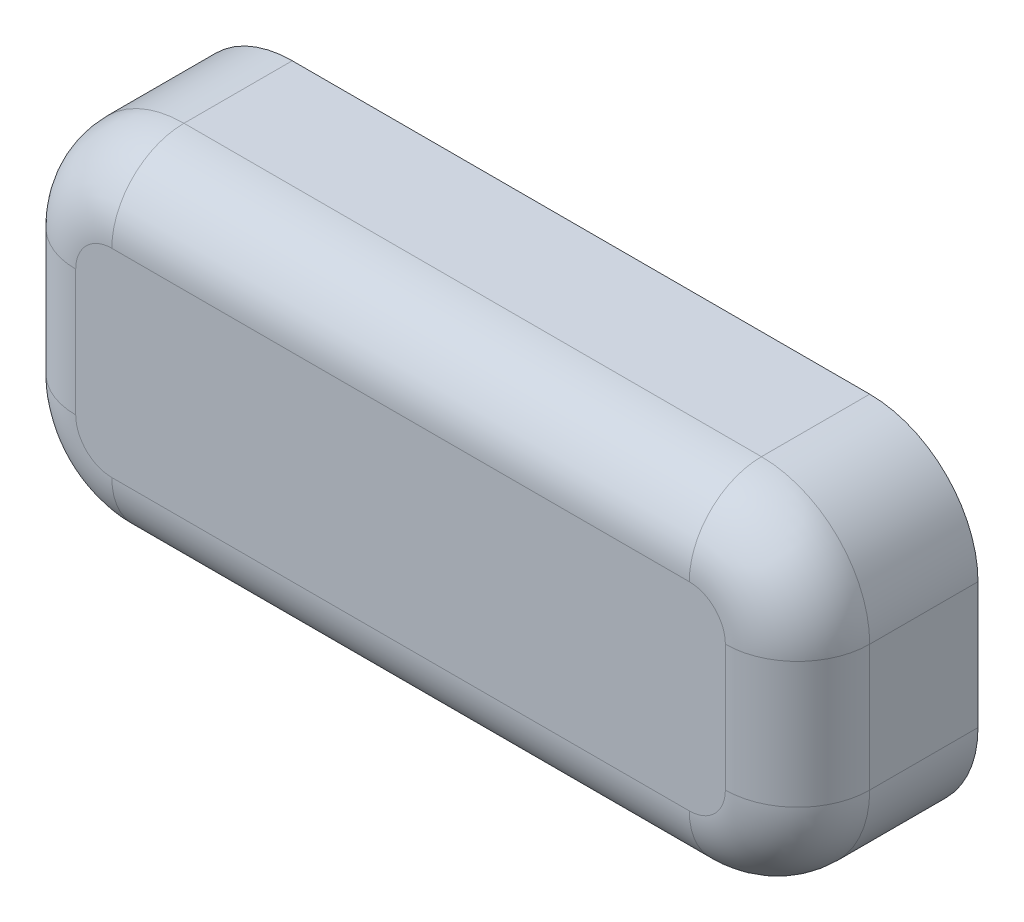
ISO-10303-21;
HEADER;
FILE_DESCRIPTION(('STEP AP214'),'2;1');
FILE_NAME('part.step','',(''),(''),'','','');
FILE_SCHEMA(('AUTOMOTIVE_DESIGN { 1 0 10303 214 1 1 1 1 }'));
ENDSEC;
DATA;
#1=APPLICATION_CONTEXT('core data for automotive mechanical design processes');
#2=APPLICATION_PROTOCOL_DEFINITION('international standard','automotive_design',2000,#1);
#3=PRODUCT_CONTEXT('',#1,'mechanical');
#4=PRODUCT('Part','Part','',(#3));
#5=PRODUCT_RELATED_PRODUCT_CATEGORY('part','',(#4));
#6=PRODUCT_DEFINITION_FORMATION('','',#4);
#7=PRODUCT_DEFINITION_CONTEXT('part definition',#1,'design');
#8=PRODUCT_DEFINITION('design','',#6,#7);
#9=PRODUCT_DEFINITION_SHAPE('','',#8);
#10=(LENGTH_UNIT() NAMED_UNIT(*) SI_UNIT(.MILLI.,.METRE.));
#11=(NAMED_UNIT(*) PLANE_ANGLE_UNIT() SI_UNIT($,.RADIAN.));
#12=(NAMED_UNIT(*) SI_UNIT($,.STERADIAN.) SOLID_ANGLE_UNIT());
#13=UNCERTAINTY_MEASURE_WITH_UNIT(LENGTH_MEASURE(1.E-05),#10,'distance_accuracy_value','');
#14=(GEOMETRIC_REPRESENTATION_CONTEXT(3) GLOBAL_UNCERTAINTY_ASSIGNED_CONTEXT((#13)) GLOBAL_UNIT_ASSIGNED_CONTEXT((#10,
#11,#12)) REPRESENTATION_CONTEXT('',''));
#15=CARTESIAN_POINT('',(0.,0.,0.));
#16=DIRECTION('',(0.,0.,1.));
#17=DIRECTION('',(1.,0.,0.));
#18=AXIS2_PLACEMENT_3D('',#15,#16,#17);
#19=CARTESIAN_POINT('',(0.,0.,0.));
#20=DIRECTION('',(0.,0.,1.));
#21=DIRECTION('',(1.,0.,0.));
#22=AXIS2_PLACEMENT_3D('',#19,#20,#21);
#23=PLANE('',#22);
#24=DIRECTION('',(0.,1.,0.));
#25=VECTOR('',#24,1.);
#26=CARTESIAN_POINT('',(220.,0.,0.));
#27=LINE('',#26,#25);
#28=CARTESIAN_POINT('',(220.,-65.,0.));
#29=VERTEX_POINT('',#28);
#30=CARTESIAN_POINT('',(220.,-30.,0.));
#31=VERTEX_POINT('',#30);
#32=EDGE_CURVE('E285',#29,#31,#27,.T.);
#33=ORIENTED_EDGE('',*,*,#32,.F.);
#34=CARTESIAN_POINT('',(190.,-65.,0.));
#35=DIRECTION('',(0.,0.,1.));
#36=DIRECTION('',(1.,0.,0.));
#37=AXIS2_PLACEMENT_3D('',#34,#35,#36);
#38=CIRCLE('',#37,30.);
#39=CARTESIAN_POINT('',(190.,-95.,0.));
#40=VERTEX_POINT('',#39);
#41=EDGE_CURVE('E302',#29,#40,#38,.F.);
#42=ORIENTED_EDGE('',*,*,#41,.T.);
#43=DIRECTION('',(1.,0.,0.));
#44=VECTOR('',#43,1.);
#45=CARTESIAN_POINT('',(0.,-95.,0.));
#46=LINE('',#45,#44);
#47=CARTESIAN_POINT('',(30.,-95.,0.));
#48=VERTEX_POINT('',#47);
#49=EDGE_CURVE('E282',#48,#40,#46,.T.);
#50=ORIENTED_EDGE('',*,*,#49,.F.);
#51=CARTESIAN_POINT('',(30.,-65.,0.));
#52=DIRECTION('',(0.,0.,1.));
#53=DIRECTION('',(1.,0.,0.));
#54=AXIS2_PLACEMENT_3D('',#51,#52,#53);
#55=CIRCLE('',#54,30.);
#56=CARTESIAN_POINT('',(0.,-65.,0.));
#57=VERTEX_POINT('',#56);
#58=EDGE_CURVE('E298',#48,#57,#55,.F.);
#59=ORIENTED_EDGE('',*,*,#58,.T.);
#60=DIRECTION('',(0.,-1.,0.));
#61=VECTOR('',#60,1.);
#62=CARTESIAN_POINT('',(0.,0.,0.));
#63=LINE('',#62,#61);
#64=CARTESIAN_POINT('',(0.,-30.,0.));
#65=VERTEX_POINT('',#64);
#66=EDGE_CURVE('E279',#65,#57,#63,.T.);
#67=ORIENTED_EDGE('',*,*,#66,.F.);
#68=CARTESIAN_POINT('',(30.,-30.,0.));
#69=DIRECTION('',(0.,0.,1.));
#70=DIRECTION('',(1.,0.,0.));
#71=AXIS2_PLACEMENT_3D('',#68,#69,#70);
#72=CIRCLE('',#71,30.);
#73=CARTESIAN_POINT('',(30.,0.,0.));
#74=VERTEX_POINT('',#73);
#75=EDGE_CURVE('E296',#65,#74,#72,.F.);
#76=ORIENTED_EDGE('',*,*,#75,.T.);
#77=DIRECTION('',(-1.,0.,0.));
#78=VECTOR('',#77,1.);
#79=CARTESIAN_POINT('',(0.,0.,0.));
#80=LINE('',#79,#78);
#81=CARTESIAN_POINT('',(190.,0.,0.));
#82=VERTEX_POINT('',#81);
#83=EDGE_CURVE('E288',#82,#74,#80,.T.);
#84=ORIENTED_EDGE('',*,*,#83,.F.);
#85=CARTESIAN_POINT('',(190.,-30.,0.));
#86=DIRECTION('',(0.,0.,1.));
#87=DIRECTION('',(1.,0.,0.));
#88=AXIS2_PLACEMENT_3D('',#85,#86,#87);
#89=CIRCLE('',#88,30.);
#90=EDGE_CURVE('E300',#82,#31,#89,.F.);
#91=ORIENTED_EDGE('',*,*,#90,.T.);
#92=EDGE_LOOP('',(#33,#42,#50,#59,#67,#76,#84,#91));
#93=FACE_BOUND('',#92,.T.);
#94=CARTESIAN_POINT('',(190.,-65.,0.));
#95=DIRECTION('',(0.,0.,1.));
#96=DIRECTION('',(1.,0.,0.));
#97=AXIS2_PLACEMENT_3D('',#94,#95,#96);
#98=CIRCLE('',#97,28.5);
#99=CARTESIAN_POINT('',(218.5,-64.9999999999999,0.));
#100=VERTEX_POINT('',#99);
#101=CARTESIAN_POINT('',(190.,-93.5,0.));
#102=VERTEX_POINT('',#101);
#103=EDGE_CURVE('E271',#100,#102,#98,.F.);
#104=ORIENTED_EDGE('',*,*,#103,.F.);
#105=DIRECTION('',(0.,1.,0.));
#106=VECTOR('',#105,1.);
#107=CARTESIAN_POINT('',(218.5,0.,0.));
#108=LINE('',#107,#106);
#109=CARTESIAN_POINT('',(218.5,-30.,0.));
#110=VERTEX_POINT('',#109);
#111=EDGE_CURVE('E268',#100,#110,#108,.T.);
#112=ORIENTED_EDGE('',*,*,#111,.T.);
#113=CARTESIAN_POINT('',(190.,-30.,0.));
#114=DIRECTION('',(0.,0.,1.));
#115=DIRECTION('',(1.,0.,0.));
#116=AXIS2_PLACEMENT_3D('',#113,#114,#115);
#117=CIRCLE('',#116,28.5);
#118=CARTESIAN_POINT('',(190.,-1.5,0.));
#119=VERTEX_POINT('',#118);
#120=EDGE_CURVE('E269',#119,#110,#117,.F.);
#121=ORIENTED_EDGE('',*,*,#120,.F.);
#122=DIRECTION('',(-1.,0.,0.));
#123=VECTOR('',#122,1.);
#124=CARTESIAN_POINT('',(0.,-1.5,0.));
#125=LINE('',#124,#123);
#126=CARTESIAN_POINT('',(30.,-1.5,0.));
#127=VERTEX_POINT('',#126);
#128=EDGE_CURVE('E64',#119,#127,#125,.T.);
#129=ORIENTED_EDGE('',*,*,#128,.T.);
#130=CARTESIAN_POINT('',(30.,-30.,0.));
#131=DIRECTION('',(0.,0.,1.));
#132=DIRECTION('',(1.,0.,0.));
#133=AXIS2_PLACEMENT_3D('',#130,#131,#132);
#134=CIRCLE('',#133,28.5);
#135=CARTESIAN_POINT('',(1.50000000000001,-30.,0.));
#136=VERTEX_POINT('',#135);
#137=EDGE_CURVE('E262',#136,#127,#134,.F.);
#138=ORIENTED_EDGE('',*,*,#137,.F.);
#139=DIRECTION('',(0.,-1.,0.));
#140=VECTOR('',#139,1.);
#141=CARTESIAN_POINT('',(1.5,0.,0.));
#142=LINE('',#141,#140);
#143=CARTESIAN_POINT('',(1.50000000000001,-65.,0.));
#144=VERTEX_POINT('',#143);
#145=EDGE_CURVE('E231',#136,#144,#142,.T.);
#146=ORIENTED_EDGE('',*,*,#145,.T.);
#147=CARTESIAN_POINT('',(30.,-65.,0.));
#148=DIRECTION('',(0.,0.,1.));
#149=DIRECTION('',(1.,0.,0.));
#150=AXIS2_PLACEMENT_3D('',#147,#148,#149);
#151=CIRCLE('',#150,28.5);
#152=CARTESIAN_POINT('',(30.,-93.5,0.));
#153=VERTEX_POINT('',#152);
#154=EDGE_CURVE('E264',#153,#144,#151,.F.);
#155=ORIENTED_EDGE('',*,*,#154,.F.);
#156=DIRECTION('',(1.,0.,0.));
#157=VECTOR('',#156,1.);
#158=CARTESIAN_POINT('',(0.,-93.5,0.));
#159=LINE('',#158,#157);
#160=EDGE_CURVE('E260',#153,#102,#159,.T.);
#161=ORIENTED_EDGE('',*,*,#160,.T.);
#162=EDGE_LOOP('',(#104,#112,#121,#129,#138,#146,#155,#161));
#163=FACE_BOUND('',#162,.T.);
#164=ADVANCED_FACE('F47',(#93,#163),#23,.F.);
#165=CARTESIAN_POINT('',(0.,0.,50.));
#166=DIRECTION('',(1.,0.,0.));
#167=DIRECTION('',(0.,1.,0.));
#168=AXIS2_PLACEMENT_3D('',#165,#166,#167);
#169=PLANE('',#168);
#170=DIRECTION('',(0.,0.,-1.));
#171=VECTOR('',#170,1.);
#172=CARTESIAN_POINT('',(0.,-65.,50.));
#173=LINE('',#172,#171);
#174=CARTESIAN_POINT('',(0.,-65.,30.));
#175=VERTEX_POINT('',#174);
#176=EDGE_CURVE('E315',#57,#175,#173,.F.);
#177=ORIENTED_EDGE('',*,*,#176,.T.);
#178=DIRECTION('',(0.,-1.,0.));
#179=VECTOR('',#178,1.);
#180=CARTESIAN_POINT('',(0.,-30.,30.));
#181=LINE('',#180,#179);
#182=CARTESIAN_POINT('',(0.,-30.,30.));
#183=VERTEX_POINT('',#182);
#184=EDGE_CURVE('E338',#175,#183,#181,.F.);
#185=ORIENTED_EDGE('',*,*,#184,.T.);
#186=DIRECTION('',(0.,0.,-1.));
#187=VECTOR('',#186,1.);
#188=CARTESIAN_POINT('',(0.,-30.,50.));
#189=LINE('',#188,#187);
#190=EDGE_CURVE('E313',#183,#65,#189,.T.);
#191=ORIENTED_EDGE('',*,*,#190,.T.);
#192=ORIENTED_EDGE('',*,*,#66,.T.);
#193=EDGE_LOOP('',(#177,#185,#191,#192));
#194=FACE_BOUND('',#193,.T.);
#195=ADVANCED_FACE('F447',(#194),#169,.F.);
#196=CARTESIAN_POINT('',(0.,-95.,50.));
#197=DIRECTION('',(0.,1.,0.));
#198=DIRECTION('',(0.,0.,1.));
#199=AXIS2_PLACEMENT_3D('',#196,#197,#198);
#200=PLANE('',#199);
#201=DIRECTION('',(0.,0.,-1.));
#202=VECTOR('',#201,1.);
#203=CARTESIAN_POINT('',(190.,-95.,50.));
#204=LINE('',#203,#202);
#205=CARTESIAN_POINT('',(190.,-95.,30.));
#206=VERTEX_POINT('',#205);
#207=EDGE_CURVE('E306',#40,#206,#204,.F.);
#208=ORIENTED_EDGE('',*,*,#207,.T.);
#209=DIRECTION('',(1.,0.,0.));
#210=VECTOR('',#209,1.);
#211=CARTESIAN_POINT('',(30.,-95.,30.));
#212=LINE('',#211,#210);
#213=CARTESIAN_POINT('',(30.,-95.,30.));
#214=VERTEX_POINT('',#213);
#215=EDGE_CURVE('E13',#206,#214,#212,.F.);
#216=ORIENTED_EDGE('',*,*,#215,.T.);
#217=DIRECTION('',(0.,0.,-1.));
#218=VECTOR('',#217,1.);
#219=CARTESIAN_POINT('',(30.,-95.,50.));
#220=LINE('',#219,#218);
#221=EDGE_CURVE('E304',#214,#48,#220,.T.);
#222=ORIENTED_EDGE('',*,*,#221,.T.);
#223=ORIENTED_EDGE('',*,*,#49,.T.);
#224=EDGE_LOOP('',(#208,#216,#222,#223));
#225=FACE_BOUND('',#224,.T.);
#226=ADVANCED_FACE('F428',(#225),#200,.F.);
#227=CARTESIAN_POINT('',(220.,0.,50.));
#228=DIRECTION('',(-1.,0.,0.));
#229=DIRECTION('',(0.,0.,1.));
#230=AXIS2_PLACEMENT_3D('',#227,#228,#229);
#231=PLANE('',#230);
#232=DIRECTION('',(0.,0.,-1.));
#233=VECTOR('',#232,1.);
#234=CARTESIAN_POINT('',(220.,-30.,50.));
#235=LINE('',#234,#233);
#236=CARTESIAN_POINT('',(220.,-30.,30.));
#237=VERTEX_POINT('',#236);
#238=EDGE_CURVE('E291',#31,#237,#235,.F.);
#239=ORIENTED_EDGE('',*,*,#238,.T.);
#240=DIRECTION('',(0.,1.,0.));
#241=VECTOR('',#240,1.);
#242=CARTESIAN_POINT('',(220.,-65.,30.));
#243=LINE('',#242,#241);
#244=CARTESIAN_POINT('',(220.,-65.,30.));
#245=VERTEX_POINT('',#244);
#246=EDGE_CURVE('E346',#237,#245,#243,.F.);
#247=ORIENTED_EDGE('',*,*,#246,.T.);
#248=DIRECTION('',(0.,0.,-1.));
#249=VECTOR('',#248,1.);
#250=CARTESIAN_POINT('',(220.,-65.,50.));
#251=LINE('',#250,#249);
#252=EDGE_CURVE('E294',#245,#29,#251,.T.);
#253=ORIENTED_EDGE('',*,*,#252,.T.);
#254=ORIENTED_EDGE('',*,*,#32,.T.);
#255=EDGE_LOOP('',(#239,#247,#253,#254));
#256=FACE_BOUND('',#255,.T.);
#257=ADVANCED_FACE('F387',(#256),#231,.F.);
#258=CARTESIAN_POINT('',(0.,0.,50.));
#259=DIRECTION('',(0.,-1.,0.));
#260=DIRECTION('',(0.,0.,-1.));
#261=AXIS2_PLACEMENT_3D('',#258,#259,#260);
#262=PLANE('',#261);
#263=DIRECTION('',(0.,0.,-1.));
#264=VECTOR('',#263,1.);
#265=CARTESIAN_POINT('',(30.,0.,50.));
#266=LINE('',#265,#264);
#267=CARTESIAN_POINT('',(30.,0.,30.));
#268=VERTEX_POINT('',#267);
#269=EDGE_CURVE('E308',#74,#268,#266,.F.);
#270=ORIENTED_EDGE('',*,*,#269,.T.);
#271=DIRECTION('',(-1.,0.,0.));
#272=VECTOR('',#271,1.);
#273=CARTESIAN_POINT('',(190.,0.,30.));
#274=LINE('',#273,#272);
#275=CARTESIAN_POINT('',(190.,0.,30.));
#276=VERTEX_POINT('',#275);
#277=EDGE_CURVE('E342',#268,#276,#274,.F.);
#278=ORIENTED_EDGE('',*,*,#277,.T.);
#279=DIRECTION('',(0.,0.,-1.));
#280=VECTOR('',#279,1.);
#281=CARTESIAN_POINT('',(190.,0.,50.));
#282=LINE('',#281,#280);
#283=EDGE_CURVE('E311',#276,#82,#282,.T.);
#284=ORIENTED_EDGE('',*,*,#283,.T.);
#285=ORIENTED_EDGE('',*,*,#83,.T.);
#286=EDGE_LOOP('',(#270,#278,#284,#285));
#287=FACE_BOUND('',#286,.T.);
#288=ADVANCED_FACE('F398',(#287),#262,.F.);
#289=CARTESIAN_POINT('',(0.,0.,50.));
#290=DIRECTION('',(0.,0.,1.));
#291=DIRECTION('',(1.,0.,0.));
#292=AXIS2_PLACEMENT_3D('',#289,#290,#291);
#293=PLANE('',#292);
#294=DIRECTION('',(0.,-1.,0.));
#295=VECTOR('',#294,1.);
#296=CARTESIAN_POINT('',(20.,-65.,50.));
#297=LINE('',#296,#295);
#298=CARTESIAN_POINT('',(20.,-30.,50.));
#299=VERTEX_POINT('',#298);
#300=CARTESIAN_POINT('',(20.,-65.,50.));
#301=VERTEX_POINT('',#300);
#302=EDGE_CURVE('E330',#299,#301,#297,.T.);
#303=ORIENTED_EDGE('',*,*,#302,.T.);
#304=CARTESIAN_POINT('',(30.,-65.,50.));
#305=DIRECTION('',(0.,0.,1.));
#306=DIRECTION('',(1.,0.,0.));
#307=AXIS2_PLACEMENT_3D('',#304,#305,#306);
#308=CIRCLE('',#307,10.);
#309=CARTESIAN_POINT('',(30.,-75.,50.));
#310=VERTEX_POINT('',#309);
#311=EDGE_CURVE('E332',#301,#310,#308,.T.);
#312=ORIENTED_EDGE('',*,*,#311,.T.);
#313=DIRECTION('',(1.,0.,0.));
#314=VECTOR('',#313,1.);
#315=CARTESIAN_POINT('',(190.,-75.,50.));
#316=LINE('',#315,#314);
#317=CARTESIAN_POINT('',(190.,-75.,50.));
#318=VERTEX_POINT('',#317);
#319=EDGE_CURVE('E318',#310,#318,#316,.T.);
#320=ORIENTED_EDGE('',*,*,#319,.T.);
#321=CARTESIAN_POINT('',(190.,-65.,50.));
#322=DIRECTION('',(0.,0.,1.));
#323=DIRECTION('',(1.,0.,0.));
#324=AXIS2_PLACEMENT_3D('',#321,#322,#323);
#325=CIRCLE('',#324,10.);
#326=CARTESIAN_POINT('',(200.,-65.,50.));
#327=VERTEX_POINT('',#326);
#328=EDGE_CURVE('E320',#318,#327,#325,.T.);
#329=ORIENTED_EDGE('',*,*,#328,.T.);
#330=DIRECTION('',(0.,1.,0.));
#331=VECTOR('',#330,1.);
#332=CARTESIAN_POINT('',(200.,-30.,50.));
#333=LINE('',#332,#331);
#334=CARTESIAN_POINT('',(200.,-30.,50.));
#335=VERTEX_POINT('',#334);
#336=EDGE_CURVE('E322',#327,#335,#333,.T.);
#337=ORIENTED_EDGE('',*,*,#336,.T.);
#338=CARTESIAN_POINT('',(190.,-30.,50.));
#339=DIRECTION('',(0.,0.,1.));
#340=DIRECTION('',(1.,0.,0.));
#341=AXIS2_PLACEMENT_3D('',#338,#339,#340);
#342=CIRCLE('',#341,10.);
#343=CARTESIAN_POINT('',(190.,-20.,50.));
#344=VERTEX_POINT('',#343);
#345=EDGE_CURVE('E324',#335,#344,#342,.T.);
#346=ORIENTED_EDGE('',*,*,#345,.T.);
#347=DIRECTION('',(-1.,0.,0.));
#348=VECTOR('',#347,1.);
#349=CARTESIAN_POINT('',(30.,-20.,50.));
#350=LINE('',#349,#348);
#351=CARTESIAN_POINT('',(30.,-20.,50.));
#352=VERTEX_POINT('',#351);
#353=EDGE_CURVE('E326',#344,#352,#350,.T.);
#354=ORIENTED_EDGE('',*,*,#353,.T.);
#355=CARTESIAN_POINT('',(30.,-30.,50.));
#356=DIRECTION('',(0.,0.,1.));
#357=DIRECTION('',(1.,0.,0.));
#358=AXIS2_PLACEMENT_3D('',#355,#356,#357);
#359=CIRCLE('',#358,10.);
#360=EDGE_CURVE('E328',#352,#299,#359,.T.);
#361=ORIENTED_EDGE('',*,*,#360,.T.);
#362=EDGE_LOOP('',(#303,#312,#320,#329,#337,#346,#354,#361));
#363=FACE_BOUND('',#362,.T.);
#364=ADVANCED_FACE('F414',(#363),#293,.T.);
#365=CARTESIAN_POINT('',(190.,-65.,50.));
#366=DIRECTION('',(0.,0.,-1.));
#367=DIRECTION('',(-1.,0.,0.));
#368=AXIS2_PLACEMENT_3D('',#365,#366,#367);
#369=CYLINDRICAL_SURFACE('',#368,30.);
#370=ORIENTED_EDGE('',*,*,#252,.F.);
#371=CARTESIAN_POINT('',(190.,-65.,30.));
#372=DIRECTION('',(0.,0.,1.));
#373=DIRECTION('',(1.,0.,0.));
#374=AXIS2_PLACEMENT_3D('',#371,#372,#373);
#375=CIRCLE('',#374,30.);
#376=EDGE_CURVE('E56',#245,#206,#375,.F.);
#377=ORIENTED_EDGE('',*,*,#376,.T.);
#378=ORIENTED_EDGE('',*,*,#207,.F.);
#379=ORIENTED_EDGE('',*,*,#41,.F.);
#380=EDGE_LOOP('',(#370,#377,#378,#379));
#381=FACE_BOUND('',#380,.T.);
#382=ADVANCED_FACE('F463',(#381),#369,.T.);
#383=CARTESIAN_POINT('',(190.,-30.,50.));
#384=DIRECTION('',(0.,0.,-1.));
#385=DIRECTION('',(-1.,0.,0.));
#386=AXIS2_PLACEMENT_3D('',#383,#384,#385);
#387=CYLINDRICAL_SURFACE('',#386,30.);
#388=ORIENTED_EDGE('',*,*,#283,.F.);
#389=CARTESIAN_POINT('',(190.,-30.,30.));
#390=DIRECTION('',(0.,0.,1.));
#391=DIRECTION('',(1.,0.,0.));
#392=AXIS2_PLACEMENT_3D('',#389,#390,#391);
#393=CIRCLE('',#392,30.);
#394=EDGE_CURVE('E344',#276,#237,#393,.F.);
#395=ORIENTED_EDGE('',*,*,#394,.T.);
#396=ORIENTED_EDGE('',*,*,#238,.F.);
#397=ORIENTED_EDGE('',*,*,#90,.F.);
#398=EDGE_LOOP('',(#388,#395,#396,#397));
#399=FACE_BOUND('',#398,.T.);
#400=ADVANCED_FACE('F384',(#399),#387,.T.);
#401=CARTESIAN_POINT('',(30.,-65.,50.));
#402=DIRECTION('',(0.,0.,-1.));
#403=DIRECTION('',(-1.,0.,0.));
#404=AXIS2_PLACEMENT_3D('',#401,#402,#403);
#405=CYLINDRICAL_SURFACE('',#404,30.);
#406=ORIENTED_EDGE('',*,*,#221,.F.);
#407=CARTESIAN_POINT('',(30.,-65.,30.));
#408=DIRECTION('',(0.,0.,1.));
#409=DIRECTION('',(1.,0.,0.));
#410=AXIS2_PLACEMENT_3D('',#407,#408,#409);
#411=CIRCLE('',#410,30.);
#412=EDGE_CURVE('E335',#214,#175,#411,.F.);
#413=ORIENTED_EDGE('',*,*,#412,.T.);
#414=ORIENTED_EDGE('',*,*,#176,.F.);
#415=ORIENTED_EDGE('',*,*,#58,.F.);
#416=EDGE_LOOP('',(#406,#413,#414,#415));
#417=FACE_BOUND('',#416,.T.);
#418=ADVANCED_FACE('F432',(#417),#405,.T.);
#419=CARTESIAN_POINT('',(30.,-30.,50.));
#420=DIRECTION('',(0.,0.,-1.));
#421=DIRECTION('',(-1.,0.,0.));
#422=AXIS2_PLACEMENT_3D('',#419,#420,#421);
#423=CYLINDRICAL_SURFACE('',#422,30.);
#424=ORIENTED_EDGE('',*,*,#190,.F.);
#425=CARTESIAN_POINT('',(30.,-30.,30.));
#426=DIRECTION('',(0.,0.,1.));
#427=DIRECTION('',(1.,0.,0.));
#428=AXIS2_PLACEMENT_3D('',#425,#426,#427);
#429=CIRCLE('',#428,30.);
#430=EDGE_CURVE('E340',#183,#268,#429,.F.);
#431=ORIENTED_EDGE('',*,*,#430,.T.);
#432=ORIENTED_EDGE('',*,*,#269,.F.);
#433=ORIENTED_EDGE('',*,*,#75,.F.);
#434=EDGE_LOOP('',(#424,#431,#432,#433));
#435=FACE_BOUND('',#434,.T.);
#436=ADVANCED_FACE('F401',(#435),#423,.T.);
#437=CARTESIAN_POINT('',(190.,-30.,30.));
#438=DIRECTION('',(0.,0.,1.));
#439=DIRECTION('',(1.,0.,0.));
#440=AXIS2_PLACEMENT_3D('',#437,#438,#439);
#441=DEGENERATE_TOROIDAL_SURFACE('',#440,10.,20.,.T.);
#442=CARTESIAN_POINT('',(200.,-30.,30.));
#443=DIRECTION('',(0.,-1.,0.));
#444=DIRECTION('',(0.,0.,-1.));
#445=AXIS2_PLACEMENT_3D('',#442,#443,#444);
#446=CIRCLE('',#445,20.);
#447=EDGE_CURVE('E365',#237,#335,#446,.T.);
#448=ORIENTED_EDGE('',*,*,#447,.F.);
#449=ORIENTED_EDGE('',*,*,#394,.F.);
#450=CARTESIAN_POINT('',(190.,-20.,30.));
#451=DIRECTION('',(-1.,0.,0.));
#452=DIRECTION('',(0.,0.,1.));
#453=AXIS2_PLACEMENT_3D('',#450,#451,#452);
#454=CIRCLE('',#453,20.);
#455=EDGE_CURVE('E51',#344,#276,#454,.T.);
#456=ORIENTED_EDGE('',*,*,#455,.F.);
#457=ORIENTED_EDGE('',*,*,#345,.F.);
#458=EDGE_LOOP('',(#448,#449,#456,#457));
#459=FACE_BOUND('',#458,.T.);
#460=ADVANCED_FACE('F49',(#459),#441,.T.);
#461=CARTESIAN_POINT('',(0.,-20.,30.));
#462=DIRECTION('',(1.,0.,0.));
#463=DIRECTION('',(0.,0.,-1.));
#464=AXIS2_PLACEMENT_3D('',#461,#462,#463);
#465=CYLINDRICAL_SURFACE('',#464,20.);
#466=ORIENTED_EDGE('',*,*,#455,.T.);
#467=ORIENTED_EDGE('',*,*,#277,.F.);
#468=CARTESIAN_POINT('',(30.,-20.,30.));
#469=DIRECTION('',(-1.,0.,0.));
#470=DIRECTION('',(0.,0.,1.));
#471=AXIS2_PLACEMENT_3D('',#468,#469,#470);
#472=CIRCLE('',#471,20.);
#473=EDGE_CURVE('E363',#352,#268,#472,.T.);
#474=ORIENTED_EDGE('',*,*,#473,.F.);
#475=ORIENTED_EDGE('',*,*,#353,.F.);
#476=EDGE_LOOP('',(#466,#467,#474,#475));
#477=FACE_BOUND('',#476,.T.);
#478=ADVANCED_FACE('F376',(#477),#465,.T.);
#479=CARTESIAN_POINT('',(200.,0.,30.));
#480=DIRECTION('',(0.,-1.,0.));
#481=DIRECTION('',(0.,0.,-1.));
#482=AXIS2_PLACEMENT_3D('',#479,#480,#481);
#483=CYLINDRICAL_SURFACE('',#482,20.);
#484=ORIENTED_EDGE('',*,*,#447,.T.);
#485=ORIENTED_EDGE('',*,*,#336,.F.);
#486=CARTESIAN_POINT('',(200.,-65.,30.));
#487=DIRECTION('',(0.,-1.,0.));
#488=DIRECTION('',(0.,0.,-1.));
#489=AXIS2_PLACEMENT_3D('',#486,#487,#488);
#490=CIRCLE('',#489,20.);
#491=EDGE_CURVE('E360',#245,#327,#490,.T.);
#492=ORIENTED_EDGE('',*,*,#491,.F.);
#493=ORIENTED_EDGE('',*,*,#246,.F.);
#494=EDGE_LOOP('',(#484,#485,#492,#493));
#495=FACE_BOUND('',#494,.T.);
#496=ADVANCED_FACE('F417',(#495),#483,.T.);
#497=CARTESIAN_POINT('',(30.,-30.,30.));
#498=DIRECTION('',(0.,0.,1.));
#499=DIRECTION('',(1.,0.,0.));
#500=AXIS2_PLACEMENT_3D('',#497,#498,#499);
#501=DEGENERATE_TOROIDAL_SURFACE('',#500,10.,20.,.T.);
#502=ORIENTED_EDGE('',*,*,#473,.T.);
#503=ORIENTED_EDGE('',*,*,#430,.F.);
#504=CARTESIAN_POINT('',(20.,-30.,30.));
#505=DIRECTION('',(0.,-1.,0.));
#506=DIRECTION('',(1.,0.,0.));
#507=AXIS2_PLACEMENT_3D('',#504,#505,#506);
#508=CIRCLE('',#507,20.);
#509=EDGE_CURVE('E357',#299,#183,#508,.T.);
#510=ORIENTED_EDGE('',*,*,#509,.F.);
#511=ORIENTED_EDGE('',*,*,#360,.F.);
#512=EDGE_LOOP('',(#502,#503,#510,#511));
#513=FACE_BOUND('',#512,.T.);
#514=ADVANCED_FACE('F405',(#513),#501,.T.);
#515=CARTESIAN_POINT('',(190.,-65.,30.));
#516=DIRECTION('',(0.,0.,1.));
#517=DIRECTION('',(1.,0.,0.));
#518=AXIS2_PLACEMENT_3D('',#515,#516,#517);
#519=DEGENERATE_TOROIDAL_SURFACE('',#518,10.,20.,.T.);
#520=ORIENTED_EDGE('',*,*,#491,.T.);
#521=ORIENTED_EDGE('',*,*,#328,.F.);
#522=CARTESIAN_POINT('',(190.,-75.,30.));
#523=DIRECTION('',(-1.,0.,0.));
#524=DIRECTION('',(0.,0.,1.));
#525=AXIS2_PLACEMENT_3D('',#522,#523,#524);
#526=CIRCLE('',#525,20.);
#527=EDGE_CURVE('E354',#206,#318,#526,.T.);
#528=ORIENTED_EDGE('',*,*,#527,.F.);
#529=ORIENTED_EDGE('',*,*,#376,.F.);
#530=EDGE_LOOP('',(#520,#521,#528,#529));
#531=FACE_BOUND('',#530,.T.);
#532=ADVANCED_FACE('F419',(#531),#519,.T.);
#533=CARTESIAN_POINT('',(20.,0.,30.));
#534=DIRECTION('',(0.,1.,0.));
#535=DIRECTION('',(-1.,0.,0.));
#536=AXIS2_PLACEMENT_3D('',#533,#534,#535);
#537=CYLINDRICAL_SURFACE('',#536,20.);
#538=ORIENTED_EDGE('',*,*,#509,.T.);
#539=ORIENTED_EDGE('',*,*,#184,.F.);
#540=CARTESIAN_POINT('',(20.,-65.,30.));
#541=DIRECTION('',(0.,-1.,0.));
#542=DIRECTION('',(0.,0.,-1.));
#543=AXIS2_PLACEMENT_3D('',#540,#541,#542);
#544=CIRCLE('',#543,20.);
#545=EDGE_CURVE('E351',#301,#175,#544,.T.);
#546=ORIENTED_EDGE('',*,*,#545,.F.);
#547=ORIENTED_EDGE('',*,*,#302,.F.);
#548=EDGE_LOOP('',(#538,#539,#546,#547));
#549=FACE_BOUND('',#548,.T.);
#550=ADVANCED_FACE('F410',(#549),#537,.T.);
#551=CARTESIAN_POINT('',(0.,-75.,30.));
#552=DIRECTION('',(-1.,0.,0.));
#553=DIRECTION('',(0.,0.,1.));
#554=AXIS2_PLACEMENT_3D('',#551,#552,#553);
#555=CYLINDRICAL_SURFACE('',#554,20.);
#556=ORIENTED_EDGE('',*,*,#527,.T.);
#557=ORIENTED_EDGE('',*,*,#319,.F.);
#558=CARTESIAN_POINT('',(30.,-75.,30.));
#559=DIRECTION('',(-1.,0.,0.));
#560=DIRECTION('',(0.,0.,1.));
#561=AXIS2_PLACEMENT_3D('',#558,#559,#560);
#562=CIRCLE('',#561,20.);
#563=EDGE_CURVE('E349',#214,#310,#562,.T.);
#564=ORIENTED_EDGE('',*,*,#563,.F.);
#565=ORIENTED_EDGE('',*,*,#215,.F.);
#566=EDGE_LOOP('',(#556,#557,#564,#565));
#567=FACE_BOUND('',#566,.T.);
#568=ADVANCED_FACE('F425',(#567),#555,.T.);
#569=CARTESIAN_POINT('',(30.,-65.,30.));
#570=DIRECTION('',(0.,0.,1.));
#571=DIRECTION('',(1.,0.,0.));
#572=AXIS2_PLACEMENT_3D('',#569,#570,#571);
#573=DEGENERATE_TOROIDAL_SURFACE('',#572,10.,20.,.T.);
#574=ORIENTED_EDGE('',*,*,#545,.T.);
#575=ORIENTED_EDGE('',*,*,#412,.F.);
#576=ORIENTED_EDGE('',*,*,#563,.T.);
#577=ORIENTED_EDGE('',*,*,#311,.F.);
#578=EDGE_LOOP('',(#574,#575,#576,#577));
#579=FACE_BOUND('',#578,.T.);
#580=ADVANCED_FACE('F435',(#579),#573,.T.);
#581=CARTESIAN_POINT('',(1.5,0.,50.));
#582=DIRECTION('',(1.,0.,0.));
#583=DIRECTION('',(0.,1.,0.));
#584=AXIS2_PLACEMENT_3D('',#581,#582,#583);
#585=PLANE('',#584);
#586=DIRECTION('',(0.,0.,1.));
#587=VECTOR('',#586,1.);
#588=CARTESIAN_POINT('',(1.50000000000001,-65.,50.));
#589=LINE('',#588,#587);
#590=CARTESIAN_POINT('',(1.50000000000001,-65.,30.));
#591=VERTEX_POINT('',#590);
#592=EDGE_CURVE('E234',#144,#591,#589,.T.);
#593=ORIENTED_EDGE('',*,*,#592,.F.);
#594=ORIENTED_EDGE('',*,*,#145,.F.);
#595=DIRECTION('',(0.,0.,1.));
#596=VECTOR('',#595,1.);
#597=CARTESIAN_POINT('',(1.50000000000001,-30.,50.));
#598=LINE('',#597,#596);
#599=CARTESIAN_POINT('',(1.50000000000001,-30.,30.));
#600=VERTEX_POINT('',#599);
#601=EDGE_CURVE('E227',#600,#136,#598,.F.);
#602=ORIENTED_EDGE('',*,*,#601,.F.);
#603=DIRECTION('',(0.,1.,0.));
#604=VECTOR('',#603,1.);
#605=CARTESIAN_POINT('',(1.5,0.,30.));
#606=LINE('',#605,#604);
#607=EDGE_CURVE('E212',#591,#600,#606,.T.);
#608=ORIENTED_EDGE('',*,*,#607,.F.);
#609=EDGE_LOOP('',(#593,#594,#602,#608));
#610=FACE_BOUND('',#609,.T.);
#611=ADVANCED_FACE('F229',(#610),#585,.T.);
#612=CARTESIAN_POINT('',(0.,-93.5,50.));
#613=DIRECTION('',(0.,1.,0.));
#614=DIRECTION('',(0.,0.,1.));
#615=AXIS2_PLACEMENT_3D('',#612,#613,#614);
#616=PLANE('',#615);
#617=DIRECTION('',(0.,0.,1.));
#618=VECTOR('',#617,1.);
#619=CARTESIAN_POINT('',(190.,-93.5,50.));
#620=LINE('',#619,#618);
#621=CARTESIAN_POINT('',(190.,-93.5,30.));
#622=VERTEX_POINT('',#621);
#623=EDGE_CURVE('E793',#102,#622,#620,.T.);
#624=ORIENTED_EDGE('',*,*,#623,.F.);
#625=ORIENTED_EDGE('',*,*,#160,.F.);
#626=DIRECTION('',(0.,0.,1.));
#627=VECTOR('',#626,1.);
#628=CARTESIAN_POINT('',(30.,-93.5,50.));
#629=LINE('',#628,#627);
#630=CARTESIAN_POINT('',(30.,-93.5,30.));
#631=VERTEX_POINT('',#630);
#632=EDGE_CURVE('E275',#631,#153,#629,.F.);
#633=ORIENTED_EDGE('',*,*,#632,.F.);
#634=DIRECTION('',(1.,0.,0.));
#635=VECTOR('',#634,1.);
#636=CARTESIAN_POINT('',(0.,-93.5,30.));
#637=LINE('',#636,#635);
#638=EDGE_CURVE('E352',#622,#631,#637,.F.);
#639=ORIENTED_EDGE('',*,*,#638,.F.);
#640=EDGE_LOOP('',(#624,#625,#633,#639));
#641=FACE_BOUND('',#640,.T.);
#642=ADVANCED_FACE('F442',(#641),#616,.T.);
#643=CARTESIAN_POINT('',(218.5,0.,50.));
#644=DIRECTION('',(-1.,0.,0.));
#645=DIRECTION('',(0.,0.,1.));
#646=AXIS2_PLACEMENT_3D('',#643,#644,#645);
#647=PLANE('',#646);
#648=DIRECTION('',(0.,0.,1.));
#649=VECTOR('',#648,1.);
#650=CARTESIAN_POINT('',(218.5,-30.,50.));
#651=LINE('',#650,#649);
#652=CARTESIAN_POINT('',(218.5,-30.,30.));
#653=VERTEX_POINT('',#652);
#654=EDGE_CURVE('E267',#110,#653,#651,.T.);
#655=ORIENTED_EDGE('',*,*,#654,.F.);
#656=ORIENTED_EDGE('',*,*,#111,.F.);
#657=DIRECTION('',(0.,0.,1.));
#658=VECTOR('',#657,1.);
#659=CARTESIAN_POINT('',(218.5,-65.,50.));
#660=LINE('',#659,#658);
#661=CARTESIAN_POINT('',(218.5,-65.,30.));
#662=VERTEX_POINT('',#661);
#663=EDGE_CURVE('E265',#662,#100,#660,.F.);
#664=ORIENTED_EDGE('',*,*,#663,.F.);
#665=DIRECTION('',(0.,1.,0.));
#666=VECTOR('',#665,1.);
#667=CARTESIAN_POINT('',(218.5,0.,30.));
#668=LINE('',#667,#666);
#669=EDGE_CURVE('E801',#653,#662,#668,.F.);
#670=ORIENTED_EDGE('',*,*,#669,.F.);
#671=EDGE_LOOP('',(#655,#656,#664,#670));
#672=FACE_BOUND('',#671,.T.);
#673=ADVANCED_FACE('F518',(#672),#647,.T.);
#674=CARTESIAN_POINT('',(0.,-1.5,50.));
#675=DIRECTION('',(0.,-1.,0.));
#676=DIRECTION('',(0.,0.,-1.));
#677=AXIS2_PLACEMENT_3D('',#674,#675,#676);
#678=PLANE('',#677);
#679=DIRECTION('',(0.,0.,-1.));
#680=VECTOR('',#679,1.);
#681=CARTESIAN_POINT('',(30.,-1.5,50.));
#682=LINE('',#681,#680);
#683=CARTESIAN_POINT('',(30.,-1.5,30.));
#684=VERTEX_POINT('',#683);
#685=EDGE_CURVE('E239',#127,#684,#682,.F.);
#686=ORIENTED_EDGE('',*,*,#685,.F.);
#687=ORIENTED_EDGE('',*,*,#128,.F.);
#688=DIRECTION('',(0.,0.,-1.));
#689=VECTOR('',#688,1.);
#690=CARTESIAN_POINT('',(190.,-1.5,50.));
#691=LINE('',#690,#689);
#692=CARTESIAN_POINT('',(190.,-1.5,30.));
#693=VERTEX_POINT('',#692);
#694=EDGE_CURVE('E235',#693,#119,#691,.T.);
#695=ORIENTED_EDGE('',*,*,#694,.F.);
#696=DIRECTION('',(1.,0.,0.));
#697=VECTOR('',#696,1.);
#698=CARTESIAN_POINT('',(0.,-1.5,30.));
#699=LINE('',#698,#697);
#700=EDGE_CURVE('E243',#684,#693,#699,.T.);
#701=ORIENTED_EDGE('',*,*,#700,.F.);
#702=EDGE_LOOP('',(#686,#687,#695,#701));
#703=FACE_BOUND('',#702,.T.);
#704=ADVANCED_FACE('F528',(#703),#678,.T.);
#705=CARTESIAN_POINT('',(0.,0.,48.5));
#706=DIRECTION('',(0.,0.,1.));
#707=DIRECTION('',(1.,0.,0.));
#708=AXIS2_PLACEMENT_3D('',#705,#706,#707);
#709=PLANE('',#708);
#710=DIRECTION('',(0.,1.,0.));
#711=VECTOR('',#710,1.);
#712=CARTESIAN_POINT('',(20.,0.,48.5));
#713=LINE('',#712,#711);
#714=CARTESIAN_POINT('',(20.,-30.,48.5));
#715=VERTEX_POINT('',#714);
#716=CARTESIAN_POINT('',(20.,-65.,48.5));
#717=VERTEX_POINT('',#716);
#718=EDGE_CURVE('E766',#715,#717,#713,.F.);
#719=ORIENTED_EDGE('',*,*,#718,.F.);
#720=CARTESIAN_POINT('',(30.,-30.,48.5));
#721=DIRECTION('',(0.,0.,1.));
#722=DIRECTION('',(1.,0.,0.));
#723=AXIS2_PLACEMENT_3D('',#720,#721,#722);
#724=CIRCLE('',#723,10.);
#725=CARTESIAN_POINT('',(30.,-20.,48.5));
#726=VERTEX_POINT('',#725);
#727=EDGE_CURVE('E247',#726,#715,#724,.T.);
#728=ORIENTED_EDGE('',*,*,#727,.F.);
#729=DIRECTION('',(1.,0.,0.));
#730=VECTOR('',#729,1.);
#731=CARTESIAN_POINT('',(0.,-20.,48.5));
#732=LINE('',#731,#730);
#733=CARTESIAN_POINT('',(190.,-20.,48.5));
#734=VERTEX_POINT('',#733);
#735=EDGE_CURVE('E781',#734,#726,#732,.F.);
#736=ORIENTED_EDGE('',*,*,#735,.F.);
#737=CARTESIAN_POINT('',(190.,-30.,48.5));
#738=DIRECTION('',(0.,0.,1.));
#739=DIRECTION('',(1.,0.,0.));
#740=AXIS2_PLACEMENT_3D('',#737,#738,#739);
#741=CIRCLE('',#740,10.);
#742=CARTESIAN_POINT('',(200.,-30.,48.5));
#743=VERTEX_POINT('',#742);
#744=EDGE_CURVE('E779',#743,#734,#741,.T.);
#745=ORIENTED_EDGE('',*,*,#744,.F.);
#746=DIRECTION('',(0.,1.,0.));
#747=VECTOR('',#746,1.);
#748=CARTESIAN_POINT('',(200.,0.,48.5));
#749=LINE('',#748,#747);
#750=CARTESIAN_POINT('',(200.,-65.,48.5));
#751=VERTEX_POINT('',#750);
#752=EDGE_CURVE('E777',#751,#743,#749,.T.);
#753=ORIENTED_EDGE('',*,*,#752,.F.);
#754=CARTESIAN_POINT('',(190.,-65.,48.5));
#755=DIRECTION('',(0.,0.,1.));
#756=DIRECTION('',(1.,0.,0.));
#757=AXIS2_PLACEMENT_3D('',#754,#755,#756);
#758=CIRCLE('',#757,10.);
#759=CARTESIAN_POINT('',(190.,-75.,48.5));
#760=VERTEX_POINT('',#759);
#761=EDGE_CURVE('E775',#760,#751,#758,.T.);
#762=ORIENTED_EDGE('',*,*,#761,.F.);
#763=DIRECTION('',(1.,0.,0.));
#764=VECTOR('',#763,1.);
#765=CARTESIAN_POINT('',(0.,-75.,48.5));
#766=LINE('',#765,#764);
#767=CARTESIAN_POINT('',(30.,-75.,48.5));
#768=VERTEX_POINT('',#767);
#769=EDGE_CURVE('E768',#768,#760,#766,.T.);
#770=ORIENTED_EDGE('',*,*,#769,.F.);
#771=CARTESIAN_POINT('',(30.,-65.,48.5));
#772=DIRECTION('',(0.,0.,1.));
#773=DIRECTION('',(1.,0.,0.));
#774=AXIS2_PLACEMENT_3D('',#771,#772,#773);
#775=CIRCLE('',#774,10.);
#776=EDGE_CURVE('E761',#717,#768,#775,.T.);
#777=ORIENTED_EDGE('',*,*,#776,.F.);
#778=EDGE_LOOP('',(#719,#728,#736,#745,#753,#762,#770,#777));
#779=FACE_BOUND('',#778,.T.);
#780=ADVANCED_FACE('F538',(#779),#709,.F.);
#781=CARTESIAN_POINT('',(190.,-65.,50.));
#782=DIRECTION('',(0.,0.,-1.));
#783=DIRECTION('',(-1.,0.,0.));
#784=AXIS2_PLACEMENT_3D('',#781,#782,#783);
#785=CYLINDRICAL_SURFACE('',#784,28.5);
#786=ORIENTED_EDGE('',*,*,#663,.T.);
#787=ORIENTED_EDGE('',*,*,#103,.T.);
#788=ORIENTED_EDGE('',*,*,#623,.T.);
#789=CARTESIAN_POINT('',(190.,-65.,30.));
#790=DIRECTION('',(0.,0.,-1.));
#791=DIRECTION('',(-1.,0.,0.));
#792=AXIS2_PLACEMENT_3D('',#789,#790,#791);
#793=CIRCLE('',#792,28.5);
#794=EDGE_CURVE('E789',#662,#622,#793,.T.);
#795=ORIENTED_EDGE('',*,*,#794,.F.);
#796=EDGE_LOOP('',(#786,#787,#788,#795));
#797=FACE_BOUND('',#796,.T.);
#798=ADVANCED_FACE('F547',(#797),#785,.F.);
#799=CARTESIAN_POINT('',(190.,-30.,50.));
#800=DIRECTION('',(0.,0.,-1.));
#801=DIRECTION('',(-1.,0.,0.));
#802=AXIS2_PLACEMENT_3D('',#799,#800,#801);
#803=CYLINDRICAL_SURFACE('',#802,28.5);
#804=ORIENTED_EDGE('',*,*,#694,.T.);
#805=ORIENTED_EDGE('',*,*,#120,.T.);
#806=ORIENTED_EDGE('',*,*,#654,.T.);
#807=CARTESIAN_POINT('',(190.,-30.,30.));
#808=DIRECTION('',(0.,0.,-1.));
#809=DIRECTION('',(-1.,0.,0.));
#810=AXIS2_PLACEMENT_3D('',#807,#808,#809);
#811=CIRCLE('',#810,28.5);
#812=EDGE_CURVE('E805',#693,#653,#811,.T.);
#813=ORIENTED_EDGE('',*,*,#812,.F.);
#814=EDGE_LOOP('',(#804,#805,#806,#813));
#815=FACE_BOUND('',#814,.T.);
#816=ADVANCED_FACE('F557',(#815),#803,.F.);
#817=CARTESIAN_POINT('',(30.,-65.,50.));
#818=DIRECTION('',(0.,0.,-1.));
#819=DIRECTION('',(-1.,0.,0.));
#820=AXIS2_PLACEMENT_3D('',#817,#818,#819);
#821=CYLINDRICAL_SURFACE('',#820,28.5);
#822=ORIENTED_EDGE('',*,*,#632,.T.);
#823=ORIENTED_EDGE('',*,*,#154,.T.);
#824=ORIENTED_EDGE('',*,*,#592,.T.);
#825=CARTESIAN_POINT('',(30.,-65.,30.));
#826=DIRECTION('',(0.,0.,-1.));
#827=DIRECTION('',(-1.,0.,0.));
#828=AXIS2_PLACEMENT_3D('',#825,#826,#827);
#829=CIRCLE('',#828,28.5);
#830=EDGE_CURVE('E224',#631,#591,#829,.T.);
#831=ORIENTED_EDGE('',*,*,#830,.F.);
#832=EDGE_LOOP('',(#822,#823,#824,#831));
#833=FACE_BOUND('',#832,.T.);
#834=ADVANCED_FACE('F567',(#833),#821,.F.);
#835=CARTESIAN_POINT('',(30.,-30.,50.));
#836=DIRECTION('',(0.,0.,-1.));
#837=DIRECTION('',(-1.,0.,0.));
#838=AXIS2_PLACEMENT_3D('',#835,#836,#837);
#839=CYLINDRICAL_SURFACE('',#838,28.5);
#840=ORIENTED_EDGE('',*,*,#601,.T.);
#841=ORIENTED_EDGE('',*,*,#137,.T.);
#842=ORIENTED_EDGE('',*,*,#685,.T.);
#843=CARTESIAN_POINT('',(30.,-30.,30.));
#844=DIRECTION('',(0.,0.,-1.));
#845=DIRECTION('',(-1.,0.,0.));
#846=AXIS2_PLACEMENT_3D('',#843,#844,#845);
#847=CIRCLE('',#846,28.5);
#848=EDGE_CURVE('E223',#600,#684,#847,.T.);
#849=ORIENTED_EDGE('',*,*,#848,.F.);
#850=EDGE_LOOP('',(#840,#841,#842,#849));
#851=FACE_BOUND('',#850,.T.);
#852=ADVANCED_FACE('F238',(#851),#839,.F.);
#853=CARTESIAN_POINT('',(190.,-30.,30.));
#854=DIRECTION('',(0.,0.,1.));
#855=DIRECTION('',(1.,0.,0.));
#856=AXIS2_PLACEMENT_3D('',#853,#854,#855);
#857=DEGENERATE_TOROIDAL_SURFACE('',#856,10.,18.5,.T.);
#858=CARTESIAN_POINT('',(200.,-30.,30.));
#859=DIRECTION('',(0.,-1.,0.));
#860=DIRECTION('',(0.,0.,-1.));
#861=AXIS2_PLACEMENT_3D('',#858,#859,#860);
#862=CIRCLE('',#861,18.5);
#863=EDGE_CURVE('E783',#653,#743,#862,.T.);
#864=ORIENTED_EDGE('',*,*,#863,.T.);
#865=ORIENTED_EDGE('',*,*,#744,.T.);
#866=CARTESIAN_POINT('',(190.,-20.,30.));
#867=DIRECTION('',(1.,0.,0.));
#868=DIRECTION('',(0.,0.,-1.));
#869=AXIS2_PLACEMENT_3D('',#866,#867,#868);
#870=CIRCLE('',#869,18.5);
#871=EDGE_CURVE('E261',#734,#693,#870,.F.);
#872=ORIENTED_EDGE('',*,*,#871,.T.);
#873=ORIENTED_EDGE('',*,*,#812,.T.);
#874=EDGE_LOOP('',(#864,#865,#872,#873));
#875=FACE_BOUND('',#874,.T.);
#876=ADVANCED_FACE('F586',(#875),#857,.F.);
#877=CARTESIAN_POINT('',(0.,-20.,30.));
#878=DIRECTION('',(1.,0.,0.));
#879=DIRECTION('',(0.,0.,-1.));
#880=AXIS2_PLACEMENT_3D('',#877,#878,#879);
#881=CYLINDRICAL_SURFACE('',#880,18.5);
#882=ORIENTED_EDGE('',*,*,#871,.F.);
#883=ORIENTED_EDGE('',*,*,#735,.T.);
#884=CARTESIAN_POINT('',(30.,-20.,30.));
#885=DIRECTION('',(1.,0.,0.));
#886=DIRECTION('',(0.,1.,0.));
#887=AXIS2_PLACEMENT_3D('',#884,#885,#886);
#888=CIRCLE('',#887,18.5);
#889=EDGE_CURVE('E252',#726,#684,#888,.F.);
#890=ORIENTED_EDGE('',*,*,#889,.T.);
#891=ORIENTED_EDGE('',*,*,#700,.T.);
#892=EDGE_LOOP('',(#882,#883,#890,#891));
#893=FACE_BOUND('',#892,.T.);
#894=ADVANCED_FACE('F595',(#893),#881,.F.);
#895=CARTESIAN_POINT('',(200.,0.,30.));
#896=DIRECTION('',(0.,-1.,0.));
#897=DIRECTION('',(0.,0.,-1.));
#898=AXIS2_PLACEMENT_3D('',#895,#896,#897);
#899=CYLINDRICAL_SURFACE('',#898,18.5);
#900=ORIENTED_EDGE('',*,*,#863,.F.);
#901=ORIENTED_EDGE('',*,*,#669,.T.);
#902=CARTESIAN_POINT('',(200.,-65.,30.));
#903=DIRECTION('',(0.,-1.,0.));
#904=DIRECTION('',(0.,0.,-1.));
#905=AXIS2_PLACEMENT_3D('',#902,#903,#904);
#906=CIRCLE('',#905,18.5);
#907=EDGE_CURVE('E248',#662,#751,#906,.T.);
#908=ORIENTED_EDGE('',*,*,#907,.T.);
#909=ORIENTED_EDGE('',*,*,#752,.T.);
#910=EDGE_LOOP('',(#900,#901,#908,#909));
#911=FACE_BOUND('',#910,.T.);
#912=ADVANCED_FACE('F606',(#911),#899,.F.);
#913=CARTESIAN_POINT('',(30.,-30.,30.));
#914=DIRECTION('',(0.,0.,1.));
#915=DIRECTION('',(1.,0.,0.));
#916=AXIS2_PLACEMENT_3D('',#913,#914,#915);
#917=DEGENERATE_TOROIDAL_SURFACE('',#916,10.,18.5,.T.);
#918=ORIENTED_EDGE('',*,*,#889,.F.);
#919=ORIENTED_EDGE('',*,*,#727,.T.);
#920=CARTESIAN_POINT('',(20.,-30.,30.));
#921=DIRECTION('',(0.,1.,0.));
#922=DIRECTION('',(-1.,0.,0.));
#923=AXIS2_PLACEMENT_3D('',#920,#921,#922);
#924=CIRCLE('',#923,18.5);
#925=EDGE_CURVE('E216',#715,#600,#924,.F.);
#926=ORIENTED_EDGE('',*,*,#925,.T.);
#927=ORIENTED_EDGE('',*,*,#848,.T.);
#928=EDGE_LOOP('',(#918,#919,#926,#927));
#929=FACE_BOUND('',#928,.T.);
#930=ADVANCED_FACE('F245',(#929),#917,.F.);
#931=CARTESIAN_POINT('',(190.,-65.,30.));
#932=DIRECTION('',(0.,0.,1.));
#933=DIRECTION('',(1.,0.,0.));
#934=AXIS2_PLACEMENT_3D('',#931,#932,#933);
#935=DEGENERATE_TOROIDAL_SURFACE('',#934,10.,18.5,.T.);
#936=ORIENTED_EDGE('',*,*,#907,.F.);
#937=ORIENTED_EDGE('',*,*,#794,.T.);
#938=CARTESIAN_POINT('',(190.,-75.,30.));
#939=DIRECTION('',(-1.,0.,0.));
#940=DIRECTION('',(0.,0.,1.));
#941=AXIS2_PLACEMENT_3D('',#938,#939,#940);
#942=CIRCLE('',#941,18.5);
#943=EDGE_CURVE('E249',#622,#760,#942,.T.);
#944=ORIENTED_EDGE('',*,*,#943,.T.);
#945=ORIENTED_EDGE('',*,*,#761,.T.);
#946=EDGE_LOOP('',(#936,#937,#944,#945));
#947=FACE_BOUND('',#946,.T.);
#948=ADVANCED_FACE('F625',(#947),#935,.F.);
#949=CARTESIAN_POINT('',(20.,0.,30.));
#950=DIRECTION('',(0.,1.,0.));
#951=DIRECTION('',(-1.,0.,0.));
#952=AXIS2_PLACEMENT_3D('',#949,#950,#951);
#953=CYLINDRICAL_SURFACE('',#952,18.5);
#954=ORIENTED_EDGE('',*,*,#925,.F.);
#955=ORIENTED_EDGE('',*,*,#718,.T.);
#956=CARTESIAN_POINT('',(20.,-65.,30.));
#957=DIRECTION('',(0.,1.,0.));
#958=DIRECTION('',(-1.,0.,0.));
#959=AXIS2_PLACEMENT_3D('',#956,#957,#958);
#960=CIRCLE('',#959,18.5);
#961=EDGE_CURVE('E219',#717,#591,#960,.F.);
#962=ORIENTED_EDGE('',*,*,#961,.T.);
#963=ORIENTED_EDGE('',*,*,#607,.T.);
#964=EDGE_LOOP('',(#954,#955,#962,#963));
#965=FACE_BOUND('',#964,.T.);
#966=ADVANCED_FACE('F214',(#965),#953,.F.);
#967=CARTESIAN_POINT('',(0.,-75.,30.));
#968=DIRECTION('',(-1.,0.,0.));
#969=DIRECTION('',(0.,0.,1.));
#970=AXIS2_PLACEMENT_3D('',#967,#968,#969);
#971=CYLINDRICAL_SURFACE('',#970,18.5);
#972=ORIENTED_EDGE('',*,*,#943,.F.);
#973=ORIENTED_EDGE('',*,*,#638,.T.);
#974=CARTESIAN_POINT('',(30.,-75.,30.));
#975=DIRECTION('',(-1.,0.,0.));
#976=DIRECTION('',(0.,-1.,0.));
#977=AXIS2_PLACEMENT_3D('',#974,#975,#976);
#978=CIRCLE('',#977,18.5);
#979=EDGE_CURVE('E764',#631,#768,#978,.T.);
#980=ORIENTED_EDGE('',*,*,#979,.T.);
#981=ORIENTED_EDGE('',*,*,#769,.T.);
#982=EDGE_LOOP('',(#972,#973,#980,#981));
#983=FACE_BOUND('',#982,.T.);
#984=ADVANCED_FACE('F645',(#983),#971,.F.);
#985=CARTESIAN_POINT('',(30.,-65.,30.));
#986=DIRECTION('',(0.,0.,1.));
#987=DIRECTION('',(1.,0.,0.));
#988=AXIS2_PLACEMENT_3D('',#985,#986,#987);
#989=DEGENERATE_TOROIDAL_SURFACE('',#988,10.,18.5,.T.);
#990=ORIENTED_EDGE('',*,*,#961,.F.);
#991=ORIENTED_EDGE('',*,*,#776,.T.);
#992=ORIENTED_EDGE('',*,*,#979,.F.);
#993=ORIENTED_EDGE('',*,*,#830,.T.);
#994=EDGE_LOOP('',(#990,#991,#992,#993));
#995=FACE_BOUND('',#994,.T.);
#996=ADVANCED_FACE('F654',(#995),#989,.F.);
#997=CLOSED_SHELL('',(#164,#195,#226,#257,#288,#364,#382,#400,#418,#436,#460,#478,#496,#514,
#532,#550,#568,#580,#611,#642,#673,#704,#780,#798,#816,#834,#852,#876,#894,#912,#930,#948,#966,
#984,#996));
#998=MANIFOLD_SOLID_BREP('B2',#997);
#999=ADVANCED_BREP_SHAPE_REPRESENTATION('',(#18,#998),#14);
#1000=SHAPE_DEFINITION_REPRESENTATION(#9,#999);
ENDSEC;
END-ISO-10303-21;
